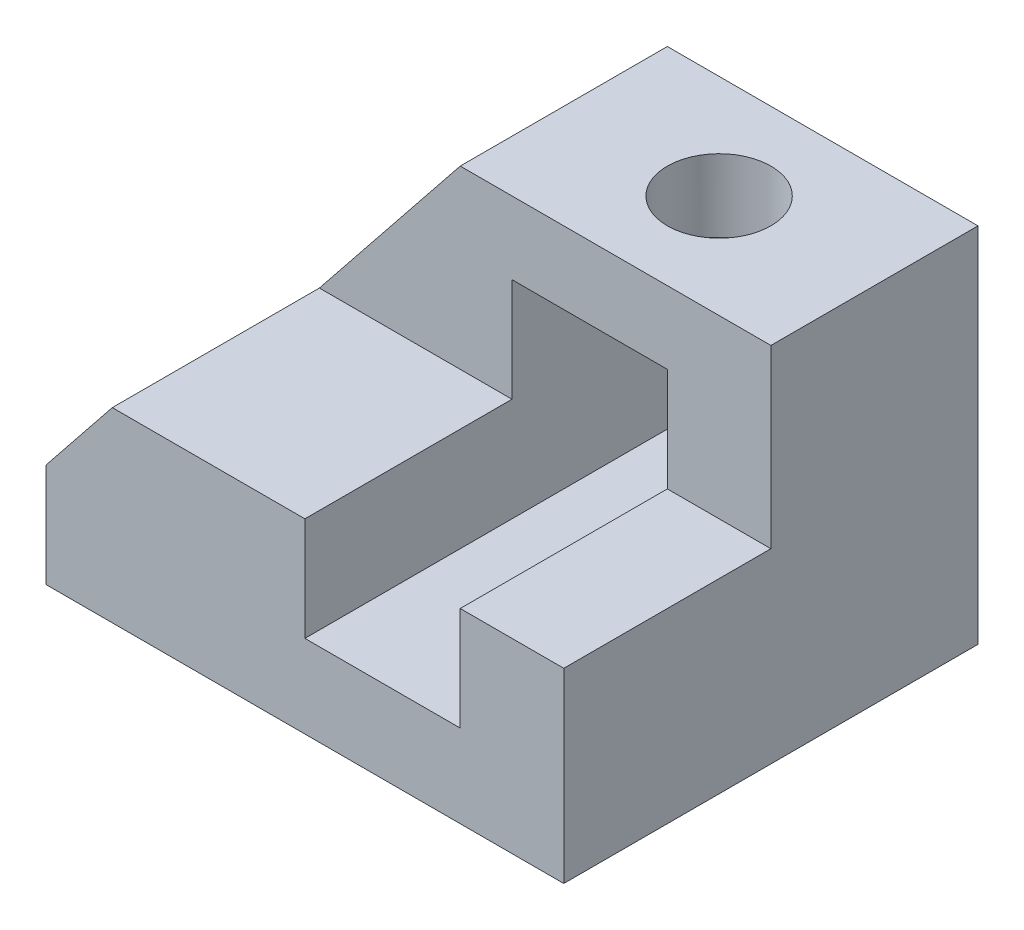
ISO-10303-21;
HEADER;
FILE_DESCRIPTION(('STEP AP214'),'2;1');
FILE_NAME('part.step','',(''),(''),'','','');
FILE_SCHEMA(('AUTOMOTIVE_DESIGN { 1 0 10303 214 1 1 1 1 }'));
ENDSEC;
DATA;
#1=APPLICATION_CONTEXT('core data for automotive mechanical design processes');
#2=APPLICATION_PROTOCOL_DEFINITION('international standard','automotive_design',2000,#1);
#3=PRODUCT_CONTEXT('',#1,'mechanical');
#4=PRODUCT('Part','Part','',(#3));
#5=PRODUCT_RELATED_PRODUCT_CATEGORY('part','',(#4));
#6=PRODUCT_DEFINITION_FORMATION('','',#4);
#7=PRODUCT_DEFINITION_CONTEXT('part definition',#1,'design');
#8=PRODUCT_DEFINITION('design','',#6,#7);
#9=PRODUCT_DEFINITION_SHAPE('','',#8);
#10=(LENGTH_UNIT() NAMED_UNIT(*) SI_UNIT(.MILLI.,.METRE.));
#11=(NAMED_UNIT(*) PLANE_ANGLE_UNIT() SI_UNIT($,.RADIAN.));
#12=(NAMED_UNIT(*) SI_UNIT($,.STERADIAN.) SOLID_ANGLE_UNIT());
#13=UNCERTAINTY_MEASURE_WITH_UNIT(LENGTH_MEASURE(1.E-05),#10,'distance_accuracy_value','');
#14=(GEOMETRIC_REPRESENTATION_CONTEXT(3) GLOBAL_UNCERTAINTY_ASSIGNED_CONTEXT((#13)) GLOBAL_UNIT_ASSIGNED_CONTEXT((#10,
#11,#12)) REPRESENTATION_CONTEXT('',''));
#15=CARTESIAN_POINT('',(0.,0.,0.));
#16=DIRECTION('',(0.,0.,1.));
#17=DIRECTION('',(1.,0.,0.));
#18=AXIS2_PLACEMENT_3D('',#15,#16,#17);
#19=CARTESIAN_POINT('',(0.,7.99999999999999,40.));
#20=DIRECTION('',(0.,-1.,0.));
#21=DIRECTION('',(1.,0.,0.));
#22=AXIS2_PLACEMENT_3D('',#19,#20,#21);
#23=PLANE('',#22);
#24=DIRECTION('',(-1.,0.,0.));
#25=VECTOR('',#24,1.);
#26=CARTESIAN_POINT('',(0.,7.99999999999999,0.));
#27=LINE('',#26,#25);
#28=CARTESIAN_POINT('',(40.,8.,0.));
#29=VERTEX_POINT('',#28);
#30=CARTESIAN_POINT('',(25.,8.,0.));
#31=VERTEX_POINT('',#30);
#32=EDGE_CURVE('E182',#29,#31,#27,.T.);
#33=ORIENTED_EDGE('',*,*,#32,.T.);
#34=DIRECTION('',(0.,0.,-1.));
#35=VECTOR('',#34,1.);
#36=CARTESIAN_POINT('',(25.,8.,40.));
#37=LINE('',#36,#35);
#38=CARTESIAN_POINT('',(25.,8.,40.));
#39=VERTEX_POINT('',#38);
#40=EDGE_CURVE('E11',#39,#31,#37,.T.);
#41=ORIENTED_EDGE('',*,*,#40,.F.);
#42=DIRECTION('',(-1.,0.,0.));
#43=VECTOR('',#42,1.);
#44=CARTESIAN_POINT('',(0.,7.99999999999999,40.));
#45=LINE('',#44,#43);
#46=CARTESIAN_POINT('',(40.,8.,40.));
#47=VERTEX_POINT('',#46);
#48=EDGE_CURVE('E172',#47,#39,#45,.T.);
#49=ORIENTED_EDGE('',*,*,#48,.F.);
#50=DIRECTION('',(0.,0.,-1.));
#51=VECTOR('',#50,1.);
#52=CARTESIAN_POINT('',(40.,8.,40.));
#53=LINE('',#52,#51);
#54=EDGE_CURVE('E156',#47,#29,#53,.T.);
#55=ORIENTED_EDGE('',*,*,#54,.T.);
#56=EDGE_LOOP('',(#33,#41,#49,#55));
#57=FACE_BOUND('',#56,.T.);
#58=ADVANCED_FACE('F48',(#57),#23,.F.);
#59=CARTESIAN_POINT('',(25.,0.,40.));
#60=DIRECTION('',(-1.,0.,0.));
#61=DIRECTION('',(0.,0.,1.));
#62=AXIS2_PLACEMENT_3D('',#59,#60,#61);
#63=PLANE('',#62);
#64=DIRECTION('',(0.,1.,0.));
#65=VECTOR('',#64,1.);
#66=CARTESIAN_POINT('',(25.,0.,0.));
#67=LINE('',#66,#65);
#68=CARTESIAN_POINT('',(25.,28.,0.));
#69=VERTEX_POINT('',#68);
#70=EDGE_CURVE('E285',#31,#69,#67,.T.);
#71=ORIENTED_EDGE('',*,*,#70,.T.);
#72=DIRECTION('',(0.,0.,-1.));
#73=VECTOR('',#72,1.);
#74=CARTESIAN_POINT('',(25.,28.,20.));
#75=LINE('',#74,#73);
#76=CARTESIAN_POINT('',(25.,28.,20.));
#77=VERTEX_POINT('',#76);
#78=EDGE_CURVE('E192',#77,#69,#75,.T.);
#79=ORIENTED_EDGE('',*,*,#78,.F.);
#80=DIRECTION('',(0.,1.,0.));
#81=VECTOR('',#80,1.);
#82=CARTESIAN_POINT('',(25.,0.,20.));
#83=LINE('',#82,#81);
#84=CARTESIAN_POINT('',(25.,18.,20.));
#85=VERTEX_POINT('',#84);
#86=EDGE_CURVE('E196',#85,#77,#83,.T.);
#87=ORIENTED_EDGE('',*,*,#86,.F.);
#88=DIRECTION('',(0.,0.,-1.));
#89=VECTOR('',#88,1.);
#90=CARTESIAN_POINT('',(25.,18.,40.));
#91=LINE('',#90,#89);
#92=CARTESIAN_POINT('',(25.,18.,40.));
#93=VERTEX_POINT('',#92);
#94=EDGE_CURVE('E56',#93,#85,#91,.T.);
#95=ORIENTED_EDGE('',*,*,#94,.F.);
#96=DIRECTION('',(0.,1.,0.));
#97=VECTOR('',#96,1.);
#98=CARTESIAN_POINT('',(25.,0.,40.));
#99=LINE('',#98,#97);
#100=EDGE_CURVE('E102',#39,#93,#99,.T.);
#101=ORIENTED_EDGE('',*,*,#100,.F.);
#102=ORIENTED_EDGE('',*,*,#40,.T.);
#103=EDGE_LOOP('',(#71,#79,#87,#95,#101,#102));
#104=FACE_BOUND('',#103,.T.);
#105=ADVANCED_FACE('F286',(#104),#63,.F.);
#106=CARTESIAN_POINT('',(0.,18.,40.));
#107=DIRECTION('',(0.,1.,0.));
#108=DIRECTION('',(0.,0.,1.));
#109=AXIS2_PLACEMENT_3D('',#106,#107,#108);
#110=PLANE('',#109);
#111=DIRECTION('',(1.,0.,0.));
#112=VECTOR('',#111,1.);
#113=CARTESIAN_POINT('',(0.,18.,20.));
#114=LINE('',#113,#112);
#115=CARTESIAN_POINT('',(6.4,18.,20.));
#116=VERTEX_POINT('',#115);
#117=EDGE_CURVE('E209',#116,#85,#114,.T.);
#118=ORIENTED_EDGE('',*,*,#117,.F.);
#119=DIRECTION('',(0.,0.,-1.));
#120=VECTOR('',#119,1.);
#121=CARTESIAN_POINT('',(6.4,18.,40.));
#122=LINE('',#121,#120);
#123=CARTESIAN_POINT('',(6.4,18.,40.));
#124=VERTEX_POINT('',#123);
#125=EDGE_CURVE('E319',#124,#116,#122,.T.);
#126=ORIENTED_EDGE('',*,*,#125,.F.);
#127=DIRECTION('',(1.,0.,0.));
#128=VECTOR('',#127,1.);
#129=CARTESIAN_POINT('',(0.,18.,40.));
#130=LINE('',#129,#128);
#131=EDGE_CURVE('E152',#124,#93,#130,.T.);
#132=ORIENTED_EDGE('',*,*,#131,.T.);
#133=ORIENTED_EDGE('',*,*,#94,.T.);
#134=EDGE_LOOP('',(#118,#126,#132,#133));
#135=FACE_BOUND('',#134,.T.);
#136=ADVANCED_FACE('F326',(#135),#110,.T.);
#137=CARTESIAN_POINT('',(-4.8780487804878,3.90243902439024,40.));
#138=DIRECTION('',(-0.78086880944303,0.624695047554424,0.));
#139=DIRECTION('',(-0.624695047554424,-0.78086880944303,0.));
#140=AXIS2_PLACEMENT_3D('',#137,#138,#139);
#141=PLANE('',#140);
#142=DIRECTION('',(0.624695047554424,0.78086880944303,0.));
#143=VECTOR('',#142,1.);
#144=CARTESIAN_POINT('',(-4.8780487804878,3.90243902439024,0.));
#145=LINE('',#144,#143);
#146=CARTESIAN_POINT('',(0.,10.,0.));
#147=VERTEX_POINT('',#146);
#148=CARTESIAN_POINT('',(20.,35.,0.));
#149=VERTEX_POINT('',#148);
#150=EDGE_CURVE('E263',#147,#149,#145,.T.);
#151=ORIENTED_EDGE('',*,*,#150,.F.);
#152=DIRECTION('',(0.,0.,-1.));
#153=VECTOR('',#152,1.);
#154=CARTESIAN_POINT('',(0.,10.,40.));
#155=LINE('',#154,#153);
#156=CARTESIAN_POINT('',(0.,10.,40.));
#157=VERTEX_POINT('',#156);
#158=EDGE_CURVE('E316',#157,#147,#155,.T.);
#159=ORIENTED_EDGE('',*,*,#158,.F.);
#160=DIRECTION('',(0.624695047554424,0.78086880944303,0.));
#161=VECTOR('',#160,1.);
#162=CARTESIAN_POINT('',(-4.8780487804878,3.90243902439024,40.));
#163=LINE('',#162,#161);
#164=EDGE_CURVE('E162',#157,#124,#163,.T.);
#165=ORIENTED_EDGE('',*,*,#164,.T.);
#166=ORIENTED_EDGE('',*,*,#125,.T.);
#167=DIRECTION('',(0.624695047554424,0.78086880944303,0.));
#168=VECTOR('',#167,1.);
#169=CARTESIAN_POINT('',(-4.8780487804878,3.90243902439024,20.));
#170=LINE('',#169,#168);
#171=CARTESIAN_POINT('',(20.,35.,20.));
#172=VERTEX_POINT('',#171);
#173=EDGE_CURVE('E210',#116,#172,#170,.T.);
#174=ORIENTED_EDGE('',*,*,#173,.T.);
#175=DIRECTION('',(0.,0.,-1.));
#176=VECTOR('',#175,1.);
#177=CARTESIAN_POINT('',(20.,35.,20.));
#178=LINE('',#177,#176);
#179=EDGE_CURVE('E188',#172,#149,#178,.T.);
#180=ORIENTED_EDGE('',*,*,#179,.T.);
#181=EDGE_LOOP('',(#151,#159,#165,#166,#174,#180));
#182=FACE_BOUND('',#181,.T.);
#183=ADVANCED_FACE('F423',(#182),#141,.T.);
#184=CARTESIAN_POINT('',(0.,0.,40.));
#185=DIRECTION('',(-1.,0.,0.));
#186=DIRECTION('',(0.,0.,1.));
#187=AXIS2_PLACEMENT_3D('',#184,#185,#186);
#188=PLANE('',#187);
#189=DIRECTION('',(0.,1.,0.));
#190=VECTOR('',#189,1.);
#191=CARTESIAN_POINT('',(0.,0.,0.));
#192=LINE('',#191,#190);
#193=CARTESIAN_POINT('',(0.,0.,0.));
#194=VERTEX_POINT('',#193);
#195=EDGE_CURVE('E372',#194,#147,#192,.T.);
#196=ORIENTED_EDGE('',*,*,#195,.F.);
#197=DIRECTION('',(0.,0.,-1.));
#198=VECTOR('',#197,1.);
#199=CARTESIAN_POINT('',(0.,0.,40.));
#200=LINE('',#199,#198);
#201=CARTESIAN_POINT('',(0.,0.,40.));
#202=VERTEX_POINT('',#201);
#203=EDGE_CURVE('E313',#202,#194,#200,.T.);
#204=ORIENTED_EDGE('',*,*,#203,.F.);
#205=DIRECTION('',(0.,1.,0.));
#206=VECTOR('',#205,1.);
#207=CARTESIAN_POINT('',(0.,0.,40.));
#208=LINE('',#207,#206);
#209=EDGE_CURVE('E171',#202,#157,#208,.T.);
#210=ORIENTED_EDGE('',*,*,#209,.T.);
#211=ORIENTED_EDGE('',*,*,#158,.T.);
#212=EDGE_LOOP('',(#196,#204,#210,#211));
#213=FACE_BOUND('',#212,.T.);
#214=ADVANCED_FACE('F420',(#213),#188,.T.);
#215=CARTESIAN_POINT('',(0.,0.,40.));
#216=DIRECTION('',(0.,-1.,0.));
#217=DIRECTION('',(0.,0.,-1.));
#218=AXIS2_PLACEMENT_3D('',#215,#216,#217);
#219=PLANE('',#218);
#220=DIRECTION('',(-1.,0.,0.));
#221=VECTOR('',#220,1.);
#222=CARTESIAN_POINT('',(0.,0.,0.));
#223=LINE('',#222,#221);
#224=CARTESIAN_POINT('',(50.,0.,0.));
#225=VERTEX_POINT('',#224);
#226=EDGE_CURVE('E303',#225,#194,#223,.T.);
#227=ORIENTED_EDGE('',*,*,#226,.F.);
#228=DIRECTION('',(0.,0.,-1.));
#229=VECTOR('',#228,1.);
#230=CARTESIAN_POINT('',(50.,0.,40.));
#231=LINE('',#230,#229);
#232=CARTESIAN_POINT('',(50.,0.,40.));
#233=VERTEX_POINT('',#232);
#234=EDGE_CURVE('E137',#233,#225,#231,.T.);
#235=ORIENTED_EDGE('',*,*,#234,.F.);
#236=DIRECTION('',(-1.,0.,0.));
#237=VECTOR('',#236,1.);
#238=CARTESIAN_POINT('',(0.,0.,40.));
#239=LINE('',#238,#237);
#240=EDGE_CURVE('E145',#233,#202,#239,.T.);
#241=ORIENTED_EDGE('',*,*,#240,.T.);
#242=ORIENTED_EDGE('',*,*,#203,.T.);
#243=EDGE_LOOP('',(#227,#235,#241,#242));
#244=FACE_BOUND('',#243,.T.);
#245=ADVANCED_FACE('F417',(#244),#219,.T.);
#246=CARTESIAN_POINT('',(50.,0.,40.));
#247=DIRECTION('',(1.,0.,0.));
#248=DIRECTION('',(0.,0.,-1.));
#249=AXIS2_PLACEMENT_3D('',#246,#247,#248);
#250=PLANE('',#249);
#251=DIRECTION('',(0.,-1.,0.));
#252=VECTOR('',#251,1.);
#253=CARTESIAN_POINT('',(50.,0.,0.));
#254=LINE('',#253,#252);
#255=CARTESIAN_POINT('',(50.,35.,0.));
#256=VERTEX_POINT('',#255);
#257=EDGE_CURVE('E260',#256,#225,#254,.T.);
#258=ORIENTED_EDGE('',*,*,#257,.F.);
#259=DIRECTION('',(0.,0.,-1.));
#260=VECTOR('',#259,1.);
#261=CARTESIAN_POINT('',(50.,35.,20.));
#262=LINE('',#261,#260);
#263=CARTESIAN_POINT('',(50.,35.,20.));
#264=VERTEX_POINT('',#263);
#265=EDGE_CURVE('E184',#264,#256,#262,.T.);
#266=ORIENTED_EDGE('',*,*,#265,.F.);
#267=DIRECTION('',(0.,-1.,0.));
#268=VECTOR('',#267,1.);
#269=CARTESIAN_POINT('',(50.,0.,20.));
#270=LINE('',#269,#268);
#271=CARTESIAN_POINT('',(50.,18.,20.));
#272=VERTEX_POINT('',#271);
#273=EDGE_CURVE('E132',#264,#272,#270,.T.);
#274=ORIENTED_EDGE('',*,*,#273,.T.);
#275=DIRECTION('',(0.,0.,-1.));
#276=VECTOR('',#275,1.);
#277=CARTESIAN_POINT('',(50.,18.,40.));
#278=LINE('',#277,#276);
#279=CARTESIAN_POINT('',(50.,18.,40.));
#280=VERTEX_POINT('',#279);
#281=EDGE_CURVE('E124',#280,#272,#278,.T.);
#282=ORIENTED_EDGE('',*,*,#281,.F.);
#283=DIRECTION('',(0.,-1.,0.));
#284=VECTOR('',#283,1.);
#285=CARTESIAN_POINT('',(50.,0.,40.));
#286=LINE('',#285,#284);
#287=EDGE_CURVE('E128',#280,#233,#286,.T.);
#288=ORIENTED_EDGE('',*,*,#287,.T.);
#289=ORIENTED_EDGE('',*,*,#234,.T.);
#290=EDGE_LOOP('',(#258,#266,#274,#282,#288,#289));
#291=FACE_BOUND('',#290,.T.);
#292=ADVANCED_FACE('F127',(#291),#250,.T.);
#293=CARTESIAN_POINT('',(40.,18.,20.));
#294=VERTEX_POINT('',#293);
#295=EDGE_CURVE('E220',#294,#272,#114,.T.);
#296=ORIENTED_EDGE('',*,*,#295,.F.);
#297=DIRECTION('',(0.,0.,-1.));
#298=VECTOR('',#297,1.);
#299=CARTESIAN_POINT('',(40.,18.,40.));
#300=LINE('',#299,#298);
#301=CARTESIAN_POINT('',(40.,18.,40.));
#302=VERTEX_POINT('',#301);
#303=EDGE_CURVE('E138',#302,#294,#300,.T.);
#304=ORIENTED_EDGE('',*,*,#303,.F.);
#305=EDGE_CURVE('E142',#302,#280,#130,.T.);
#306=ORIENTED_EDGE('',*,*,#305,.T.);
#307=ORIENTED_EDGE('',*,*,#281,.T.);
#308=EDGE_LOOP('',(#296,#304,#306,#307));
#309=FACE_BOUND('',#308,.T.);
#310=ADVANCED_FACE('F148',(#309),#110,.T.);
#311=CARTESIAN_POINT('',(40.,0.,40.));
#312=DIRECTION('',(1.,0.,0.));
#313=DIRECTION('',(0.,0.,-1.));
#314=AXIS2_PLACEMENT_3D('',#311,#312,#313);
#315=PLANE('',#314);
#316=DIRECTION('',(0.,0.,-1.));
#317=VECTOR('',#316,1.);
#318=CARTESIAN_POINT('',(40.,28.,20.));
#319=LINE('',#318,#317);
#320=CARTESIAN_POINT('',(40.,28.,20.));
#321=VERTEX_POINT('',#320);
#322=CARTESIAN_POINT('',(40.,28.,10.));
#323=VERTEX_POINT('',#322);
#324=EDGE_CURVE('E178',#321,#323,#319,.T.);
#325=ORIENTED_EDGE('',*,*,#324,.T.);
#326=CARTESIAN_POINT('',(40.,28.,0.));
#327=VERTEX_POINT('',#326);
#328=EDGE_CURVE('E183',#323,#327,#319,.T.);
#329=ORIENTED_EDGE('',*,*,#328,.T.);
#330=DIRECTION('',(0.,-1.,0.));
#331=VECTOR('',#330,1.);
#332=CARTESIAN_POINT('',(40.,0.,0.));
#333=LINE('',#332,#331);
#334=EDGE_CURVE('E94',#327,#29,#333,.T.);
#335=ORIENTED_EDGE('',*,*,#334,.T.);
#336=ORIENTED_EDGE('',*,*,#54,.F.);
#337=DIRECTION('',(0.,-1.,0.));
#338=VECTOR('',#337,1.);
#339=CARTESIAN_POINT('',(40.,0.,40.));
#340=LINE('',#339,#338);
#341=EDGE_CURVE('E69',#302,#47,#340,.T.);
#342=ORIENTED_EDGE('',*,*,#341,.F.);
#343=ORIENTED_EDGE('',*,*,#303,.T.);
#344=DIRECTION('',(0.,-1.,0.));
#345=VECTOR('',#344,1.);
#346=CARTESIAN_POINT('',(40.,0.,20.));
#347=LINE('',#346,#345);
#348=EDGE_CURVE('E224',#321,#294,#347,.T.);
#349=ORIENTED_EDGE('',*,*,#348,.F.);
#350=EDGE_LOOP('',(#325,#329,#335,#336,#342,#343,#349));
#351=FACE_BOUND('',#350,.T.);
#352=ADVANCED_FACE('F438',(#351),#315,.F.);
#353=CARTESIAN_POINT('',(0.,0.,40.));
#354=DIRECTION('',(0.,0.,1.));
#355=DIRECTION('',(1.,0.,0.));
#356=AXIS2_PLACEMENT_3D('',#353,#354,#355);
#357=PLANE('',#356);
#358=ORIENTED_EDGE('',*,*,#48,.T.);
#359=ORIENTED_EDGE('',*,*,#100,.T.);
#360=ORIENTED_EDGE('',*,*,#131,.F.);
#361=ORIENTED_EDGE('',*,*,#164,.F.);
#362=ORIENTED_EDGE('',*,*,#209,.F.);
#363=ORIENTED_EDGE('',*,*,#240,.F.);
#364=ORIENTED_EDGE('',*,*,#287,.F.);
#365=ORIENTED_EDGE('',*,*,#305,.F.);
#366=ORIENTED_EDGE('',*,*,#341,.T.);
#367=EDGE_LOOP('',(#358,#359,#360,#361,#362,#363,#364,#365,#366));
#368=FACE_BOUND('',#367,.T.);
#369=ADVANCED_FACE('F141',(#368),#357,.T.);
#370=CARTESIAN_POINT('',(0.,0.,0.));
#371=DIRECTION('',(0.,0.,1.));
#372=DIRECTION('',(1.,0.,0.));
#373=AXIS2_PLACEMENT_3D('',#370,#371,#372);
#374=PLANE('',#373);
#375=DIRECTION('',(1.,0.,0.));
#376=VECTOR('',#375,1.);
#377=CARTESIAN_POINT('',(0.,35.,0.));
#378=LINE('',#377,#376);
#379=EDGE_CURVE('E197',#149,#256,#378,.T.);
#380=ORIENTED_EDGE('',*,*,#379,.T.);
#381=ORIENTED_EDGE('',*,*,#257,.T.);
#382=ORIENTED_EDGE('',*,*,#226,.T.);
#383=ORIENTED_EDGE('',*,*,#195,.T.);
#384=ORIENTED_EDGE('',*,*,#150,.T.);
#385=EDGE_LOOP('',(#380,#381,#382,#383,#384));
#386=FACE_BOUND('',#385,.T.);
#387=ORIENTED_EDGE('',*,*,#32,.F.);
#388=ORIENTED_EDGE('',*,*,#334,.F.);
#389=DIRECTION('',(1.,0.,0.));
#390=VECTOR('',#389,1.);
#391=CARTESIAN_POINT('',(0.,28.,0.));
#392=LINE('',#391,#390);
#393=EDGE_CURVE('E202',#69,#327,#392,.T.);
#394=ORIENTED_EDGE('',*,*,#393,.F.);
#395=ORIENTED_EDGE('',*,*,#70,.F.);
#396=EDGE_LOOP('',(#387,#388,#394,#395));
#397=FACE_BOUND('',#396,.T.);
#398=ADVANCED_FACE('F257',(#386,#397),#374,.F.);
#399=CARTESIAN_POINT('',(0.,28.,20.));
#400=DIRECTION('',(0.,1.,0.));
#401=DIRECTION('',(0.,0.,1.));
#402=AXIS2_PLACEMENT_3D('',#399,#400,#401);
#403=PLANE('',#402);
#404=ORIENTED_EDGE('',*,*,#328,.F.);
#405=CARTESIAN_POINT('',(35.,28.,10.));
#406=DIRECTION('',(0.,1.,0.));
#407=DIRECTION('',(0.,0.,1.));
#408=AXIS2_PLACEMENT_3D('',#405,#406,#407);
#409=CIRCLE('',#408,5.);
#410=EDGE_CURVE('E61',#323,#323,#409,.T.);
#411=ORIENTED_EDGE('',*,*,#410,.T.);
#412=ORIENTED_EDGE('',*,*,#324,.F.);
#413=DIRECTION('',(1.,0.,0.));
#414=VECTOR('',#413,1.);
#415=CARTESIAN_POINT('',(0.,28.,20.));
#416=LINE('',#415,#414);
#417=EDGE_CURVE('E201',#77,#321,#416,.T.);
#418=ORIENTED_EDGE('',*,*,#417,.F.);
#419=ORIENTED_EDGE('',*,*,#78,.T.);
#420=ORIENTED_EDGE('',*,*,#393,.T.);
#421=EDGE_LOOP('',(#404,#411,#412,#418,#419,#420));
#422=FACE_BOUND('',#421,.T.);
#423=ADVANCED_FACE('F246',(#422),#403,.F.);
#424=CARTESIAN_POINT('',(0.,35.,20.));
#425=DIRECTION('',(0.,1.,0.));
#426=DIRECTION('',(0.,0.,1.));
#427=AXIS2_PLACEMENT_3D('',#424,#425,#426);
#428=PLANE('',#427);
#429=CARTESIAN_POINT('',(35.,35.,10.));
#430=DIRECTION('',(0.,1.,0.));
#431=DIRECTION('',(0.,0.,1.));
#432=AXIS2_PLACEMENT_3D('',#429,#430,#431);
#433=CIRCLE('',#432,5.);
#434=CARTESIAN_POINT('',(35.,35.,15.));
#435=VERTEX_POINT('',#434);
#436=EDGE_CURVE('E233',#435,#435,#433,.T.);
#437=ORIENTED_EDGE('',*,*,#436,.F.);
#438=EDGE_LOOP('',(#437));
#439=FACE_BOUND('',#438,.T.);
#440=ORIENTED_EDGE('',*,*,#379,.F.);
#441=ORIENTED_EDGE('',*,*,#179,.F.);
#442=DIRECTION('',(1.,0.,0.));
#443=VECTOR('',#442,1.);
#444=CARTESIAN_POINT('',(0.,35.,20.));
#445=LINE('',#444,#443);
#446=EDGE_CURVE('E214',#172,#264,#445,.T.);
#447=ORIENTED_EDGE('',*,*,#446,.T.);
#448=ORIENTED_EDGE('',*,*,#265,.T.);
#449=EDGE_LOOP('',(#440,#441,#447,#448));
#450=FACE_BOUND('',#449,.T.);
#451=ADVANCED_FACE('F242',(#439,#450),#428,.T.);
#452=CARTESIAN_POINT('',(0.,0.,20.));
#453=DIRECTION('',(0.,0.,1.));
#454=DIRECTION('',(1.,0.,0.));
#455=AXIS2_PLACEMENT_3D('',#452,#453,#454);
#456=PLANE('',#455);
#457=ORIENTED_EDGE('',*,*,#417,.T.);
#458=ORIENTED_EDGE('',*,*,#348,.T.);
#459=ORIENTED_EDGE('',*,*,#295,.T.);
#460=ORIENTED_EDGE('',*,*,#273,.F.);
#461=ORIENTED_EDGE('',*,*,#446,.F.);
#462=ORIENTED_EDGE('',*,*,#173,.F.);
#463=ORIENTED_EDGE('',*,*,#117,.T.);
#464=ORIENTED_EDGE('',*,*,#86,.T.);
#465=EDGE_LOOP('',(#457,#458,#459,#460,#461,#462,#463,#464));
#466=FACE_BOUND('',#465,.T.);
#467=ADVANCED_FACE('F245',(#466),#456,.T.);
#468=CARTESIAN_POINT('',(35.,15.,10.));
#469=DIRECTION('',(0.,1.,0.));
#470=DIRECTION('',(0.,0.,1.));
#471=AXIS2_PLACEMENT_3D('',#468,#469,#470);
#472=CYLINDRICAL_SURFACE('',#471,5.);
#473=ORIENTED_EDGE('',*,*,#436,.T.);
#474=EDGE_LOOP('',(#473));
#475=FACE_BOUND('',#474,.T.);
#476=ORIENTED_EDGE('',*,*,#410,.F.);
#477=EDGE_LOOP('',(#476));
#478=FACE_BOUND('',#477,.T.);
#479=ADVANCED_FACE('F240',(#475,#478),#472,.F.);
#480=CLOSED_SHELL('',(#58,#105,#136,#183,#214,#245,#292,#310,#352,#369,#398,#423,#451,#467,#479));
#481=MANIFOLD_SOLID_BREP('B2',#480);
#482=ADVANCED_BREP_SHAPE_REPRESENTATION('',(#18,#481),#14);
#483=SHAPE_DEFINITION_REPRESENTATION(#9,#482);
ENDSEC;
END-ISO-10303-21;
